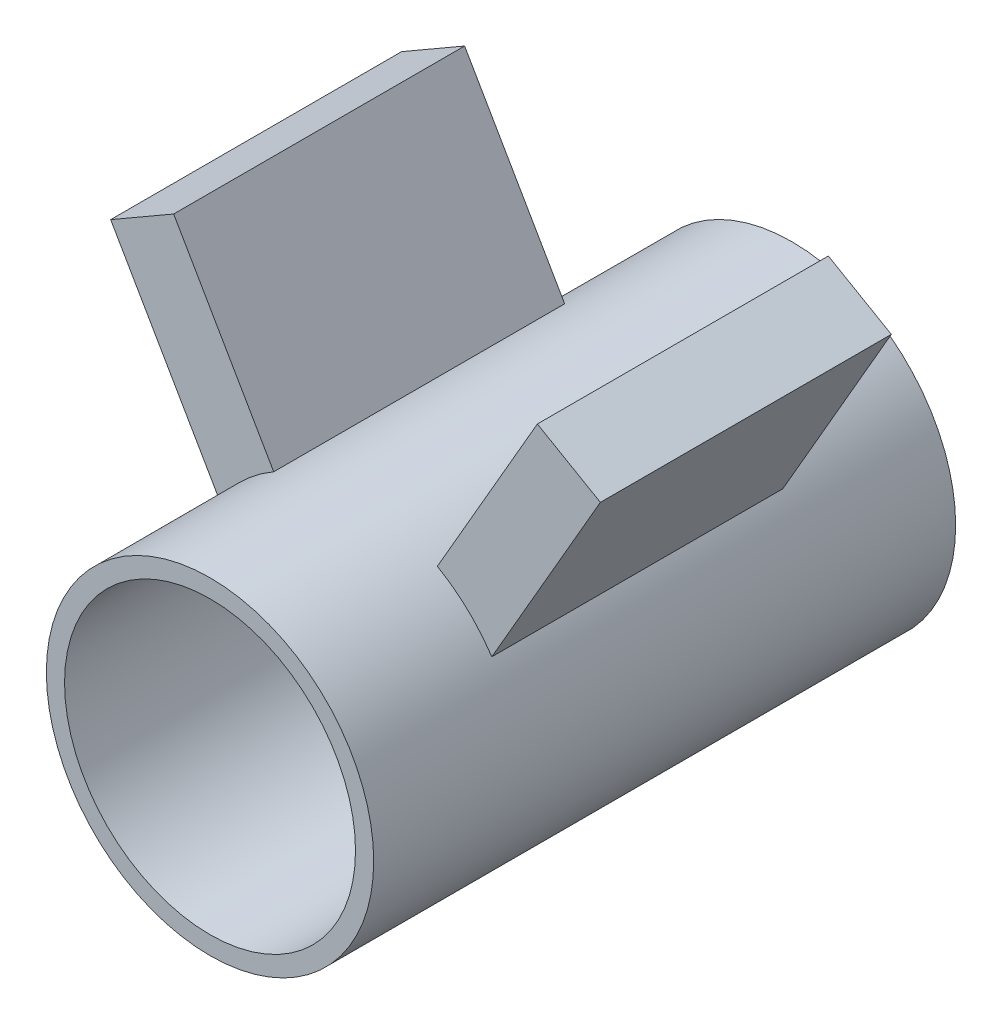
ISO-10303-21;
HEADER;
FILE_DESCRIPTION(('STEP AP214'),'2;1');
FILE_NAME('part.step','',(''),(''),'','','');
FILE_SCHEMA(('AUTOMOTIVE_DESIGN { 1 0 10303 214 1 1 1 1 }'));
ENDSEC;
DATA;
#1=APPLICATION_CONTEXT('core data for automotive mechanical design processes');
#2=APPLICATION_PROTOCOL_DEFINITION('international standard','automotive_design',2000,#1);
#3=PRODUCT_CONTEXT('',#1,'mechanical');
#4=PRODUCT('Part','Part','',(#3));
#5=PRODUCT_RELATED_PRODUCT_CATEGORY('part','',(#4));
#6=PRODUCT_DEFINITION_FORMATION('','',#4);
#7=PRODUCT_DEFINITION_CONTEXT('part definition',#1,'design');
#8=PRODUCT_DEFINITION('design','',#6,#7);
#9=PRODUCT_DEFINITION_SHAPE('','',#8);
#10=(LENGTH_UNIT() NAMED_UNIT(*) SI_UNIT(.MILLI.,.METRE.));
#11=(NAMED_UNIT(*) PLANE_ANGLE_UNIT() SI_UNIT($,.RADIAN.));
#12=(NAMED_UNIT(*) SI_UNIT($,.STERADIAN.) SOLID_ANGLE_UNIT());
#13=UNCERTAINTY_MEASURE_WITH_UNIT(LENGTH_MEASURE(1.E-05),#10,'distance_accuracy_value','');
#14=(GEOMETRIC_REPRESENTATION_CONTEXT(3) GLOBAL_UNCERTAINTY_ASSIGNED_CONTEXT((#13)) GLOBAL_UNIT_ASSIGNED_CONTEXT((#10,
#11,#12)) REPRESENTATION_CONTEXT('',''));
#15=CARTESIAN_POINT('',(0.,0.,0.));
#16=DIRECTION('',(0.,0.,1.));
#17=DIRECTION('',(1.,0.,0.));
#18=AXIS2_PLACEMENT_3D('',#15,#16,#17);
#19=CARTESIAN_POINT('',(0.,0.,25.4));
#20=DIRECTION('',(0.,0.,-1.));
#21=DIRECTION('',(-1.,0.,0.));
#22=AXIS2_PLACEMENT_3D('',#19,#20,#21);
#23=CYLINDRICAL_SURFACE('',#22,12.7);
#24=CARTESIAN_POINT('',(0.,0.,25.4));
#25=DIRECTION('',(0.,0.,1.));
#26=DIRECTION('',(1.,0.,0.));
#27=AXIS2_PLACEMENT_3D('',#24,#25,#26);
#28=CIRCLE('',#27,12.7);
#29=CARTESIAN_POINT('',(12.7,0.,25.4));
#30=VERTEX_POINT('',#29);
#31=EDGE_CURVE('E25',#30,#30,#28,.T.);
#32=ORIENTED_EDGE('',*,*,#31,.T.);
#33=EDGE_LOOP('',(#32));
#34=FACE_BOUND('',#33,.T.);
#35=CARTESIAN_POINT('',(0.,0.,-25.4));
#36=DIRECTION('',(0.,0.,1.));
#37=DIRECTION('',(1.,0.,0.));
#38=AXIS2_PLACEMENT_3D('',#35,#36,#37);
#39=CIRCLE('',#38,12.7);
#40=CARTESIAN_POINT('',(12.7,0.,-25.4));
#41=VERTEX_POINT('',#40);
#42=EDGE_CURVE('E144',#41,#41,#39,.T.);
#43=ORIENTED_EDGE('',*,*,#42,.F.);
#44=EDGE_LOOP('',(#43));
#45=FACE_BOUND('',#44,.T.);
#46=ADVANCED_FACE('F17',(#34,#45),#23,.F.);
#47=CARTESIAN_POINT('',(0.,0.,25.4));
#48=DIRECTION('',(0.,0.,-1.));
#49=DIRECTION('',(-1.,0.,0.));
#50=AXIS2_PLACEMENT_3D('',#47,#48,#49);
#51=CYLINDRICAL_SURFACE('',#50,14.2875);
#52=DIRECTION('',(0.,0.,-1.));
#53=VECTOR('',#52,1.);
#54=CARTESIAN_POINT('',(-7.14375,12.3733379565702,12.7));
#55=LINE('',#54,#53);
#56=CARTESIAN_POINT('',(-7.14375,12.3733379565702,12.7));
#57=VERTEX_POINT('',#56);
#58=CARTESIAN_POINT('',(-7.14375,12.3733379565702,-12.7));
#59=VERTEX_POINT('',#58);
#60=EDGE_CURVE('E33',#57,#59,#55,.T.);
#61=ORIENTED_EDGE('',*,*,#60,.F.);
#62=CARTESIAN_POINT('',(0.,0.,12.7));
#63=DIRECTION('',(0.,0.,1.));
#64=DIRECTION('',(1.,0.,0.));
#65=AXIS2_PLACEMENT_3D('',#62,#63,#64);
#66=CIRCLE('',#65,14.2875);
#67=CARTESIAN_POINT('',(-11.8986784017432,7.90911553474159,12.7));
#68=VERTEX_POINT('',#67);
#69=EDGE_CURVE('E38',#57,#68,#66,.T.);
#70=ORIENTED_EDGE('',*,*,#69,.T.);
#71=DIRECTION('',(0.,0.,-1.));
#72=VECTOR('',#71,1.);
#73=CARTESIAN_POINT('',(-11.8986784017432,7.90911553474159,12.7));
#74=LINE('',#73,#72);
#75=CARTESIAN_POINT('',(-11.8986784017432,7.90911553474159,-12.7));
#76=VERTEX_POINT('',#75);
#77=EDGE_CURVE('E102',#68,#76,#74,.T.);
#78=ORIENTED_EDGE('',*,*,#77,.T.);
#79=CARTESIAN_POINT('',(0.,0.,-12.7));
#80=DIRECTION('',(0.,0.,1.));
#81=DIRECTION('',(1.,0.,0.));
#82=AXIS2_PLACEMENT_3D('',#79,#80,#81);
#83=CIRCLE('',#82,14.2875);
#84=EDGE_CURVE('E106',#59,#76,#83,.T.);
#85=ORIENTED_EDGE('',*,*,#84,.F.);
#86=EDGE_LOOP('',(#61,#70,#78,#85));
#87=FACE_BOUND('',#86,.T.);
#88=DIRECTION('',(0.,0.,-1.));
#89=VECTOR('',#88,1.);
#90=CARTESIAN_POINT('',(11.8986784017432,7.90911553474158,12.7));
#91=LINE('',#90,#89);
#92=CARTESIAN_POINT('',(11.8986784017432,7.90911553474159,12.7));
#93=VERTEX_POINT('',#92);
#94=CARTESIAN_POINT('',(11.8986784017432,7.90911553474159,-12.7));
#95=VERTEX_POINT('',#94);
#96=EDGE_CURVE('E145',#93,#95,#91,.T.);
#97=ORIENTED_EDGE('',*,*,#96,.F.);
#98=CARTESIAN_POINT('',(0.,0.,12.7));
#99=DIRECTION('',(0.,0.,1.));
#100=DIRECTION('',(1.,0.,0.));
#101=AXIS2_PLACEMENT_3D('',#98,#99,#100);
#102=CIRCLE('',#101,14.2875);
#103=CARTESIAN_POINT('',(7.14375,12.3733379565702,12.7));
#104=VERTEX_POINT('',#103);
#105=EDGE_CURVE('E126',#93,#104,#102,.T.);
#106=ORIENTED_EDGE('',*,*,#105,.T.);
#107=DIRECTION('',(0.,0.,-1.));
#108=VECTOR('',#107,1.);
#109=CARTESIAN_POINT('',(7.14375,12.3733379565702,12.7));
#110=LINE('',#109,#108);
#111=CARTESIAN_POINT('',(7.14375,12.3733379565702,-12.7));
#112=VERTEX_POINT('',#111);
#113=EDGE_CURVE('E142',#104,#112,#110,.T.);
#114=ORIENTED_EDGE('',*,*,#113,.T.);
#115=CARTESIAN_POINT('',(0.,0.,-12.7));
#116=DIRECTION('',(0.,0.,1.));
#117=DIRECTION('',(1.,0.,0.));
#118=AXIS2_PLACEMENT_3D('',#115,#116,#117);
#119=CIRCLE('',#118,14.2875);
#120=EDGE_CURVE('E137',#95,#112,#119,.T.);
#121=ORIENTED_EDGE('',*,*,#120,.F.);
#122=EDGE_LOOP('',(#97,#106,#114,#121));
#123=FACE_BOUND('',#122,.T.);
#124=CARTESIAN_POINT('',(0.,0.,25.4));
#125=DIRECTION('',(0.,0.,1.));
#126=DIRECTION('',(1.,0.,0.));
#127=AXIS2_PLACEMENT_3D('',#124,#125,#126);
#128=CIRCLE('',#127,14.2875);
#129=CARTESIAN_POINT('',(14.2875,0.,25.4));
#130=VERTEX_POINT('',#129);
#131=EDGE_CURVE('E11',#130,#130,#128,.T.);
#132=ORIENTED_EDGE('',*,*,#131,.F.);
#133=EDGE_LOOP('',(#132));
#134=FACE_BOUND('',#133,.T.);
#135=CARTESIAN_POINT('',(0.,0.,-25.4));
#136=DIRECTION('',(0.,0.,1.));
#137=DIRECTION('',(1.,0.,0.));
#138=AXIS2_PLACEMENT_3D('',#135,#136,#137);
#139=CIRCLE('',#138,14.2875);
#140=CARTESIAN_POINT('',(14.2875,0.,-25.4));
#141=VERTEX_POINT('',#140);
#142=EDGE_CURVE('E20',#141,#141,#139,.T.);
#143=ORIENTED_EDGE('',*,*,#142,.T.);
#144=EDGE_LOOP('',(#143));
#145=FACE_BOUND('',#144,.T.);
#146=ADVANCED_FACE('F158',(#87,#123,#134,#145),#51,.T.);
#147=CARTESIAN_POINT('',(0.,0.,25.4));
#148=DIRECTION('',(0.,0.,1.));
#149=DIRECTION('',(1.,0.,0.));
#150=AXIS2_PLACEMENT_3D('',#147,#148,#149);
#151=PLANE('',#150);
#152=ORIENTED_EDGE('',*,*,#31,.F.);
#153=EDGE_LOOP('',(#152));
#154=FACE_BOUND('',#153,.T.);
#155=ORIENTED_EDGE('',*,*,#131,.T.);
#156=EDGE_LOOP('',(#155));
#157=FACE_BOUND('',#156,.T.);
#158=ADVANCED_FACE('F163',(#154,#157),#151,.T.);
#159=CARTESIAN_POINT('',(0.,0.,-25.4));
#160=DIRECTION('',(0.,0.,1.));
#161=DIRECTION('',(1.,0.,0.));
#162=AXIS2_PLACEMENT_3D('',#159,#160,#161);
#163=PLANE('',#162);
#164=ORIENTED_EDGE('',*,*,#42,.T.);
#165=EDGE_LOOP('',(#164));
#166=FACE_BOUND('',#165,.T.);
#167=ORIENTED_EDGE('',*,*,#142,.F.);
#168=EDGE_LOOP('',(#167));
#169=FACE_BOUND('',#168,.T.);
#170=ADVANCED_FACE('F160',(#166,#169),#163,.F.);
#171=CARTESIAN_POINT('',(11.509375,19.934822263363,12.7));
#172=DIRECTION('',(-0.866025403784439,0.5,0.));
#173=DIRECTION('',(-0.5,-0.866025403784439,0.));
#174=AXIS2_PLACEMENT_3D('',#171,#172,#173);
#175=PLANE('',#174);
#176=DIRECTION('',(0.5,0.866025403784439,0.));
#177=VECTOR('',#176,1.);
#178=CARTESIAN_POINT('',(11.509375,19.934822263363,-12.7));
#179=LINE('',#178,#177);
#180=CARTESIAN_POINT('',(15.875,27.496306570156,-12.7));
#181=VERTEX_POINT('',#180);
#182=EDGE_CURVE('E123',#112,#181,#179,.T.);
#183=ORIENTED_EDGE('',*,*,#182,.F.);
#184=ORIENTED_EDGE('',*,*,#113,.F.);
#185=DIRECTION('',(0.5,0.866025403784439,0.));
#186=VECTOR('',#185,1.);
#187=CARTESIAN_POINT('',(11.509375,19.934822263363,12.7));
#188=LINE('',#187,#186);
#189=CARTESIAN_POINT('',(15.875,27.496306570156,12.7));
#190=VERTEX_POINT('',#189);
#191=EDGE_CURVE('E128',#104,#190,#188,.T.);
#192=ORIENTED_EDGE('',*,*,#191,.T.);
#193=DIRECTION('',(0.,0.,-1.));
#194=VECTOR('',#193,1.);
#195=CARTESIAN_POINT('',(15.875,27.496306570156,12.7));
#196=LINE('',#195,#194);
#197=EDGE_CURVE('E131',#190,#181,#196,.T.);
#198=ORIENTED_EDGE('',*,*,#197,.T.);
#199=EDGE_LOOP('',(#183,#184,#192,#198));
#200=FACE_BOUND('',#199,.T.);
#201=ADVANCED_FACE('F162',(#200),#175,.T.);
#202=CARTESIAN_POINT('',(16.6364698578871,16.1152110524487,12.7));
#203=DIRECTION('',(0.866025403784439,-0.5,0.));
#204=DIRECTION('',(0.5,0.866025403784439,0.));
#205=AXIS2_PLACEMENT_3D('',#202,#203,#204);
#206=PLANE('',#205);
#207=DIRECTION('',(-0.5,-0.866025403784439,0.));
#208=VECTOR('',#207,1.);
#209=CARTESIAN_POINT('',(16.6364698578871,16.1152110524487,-12.7));
#210=LINE('',#209,#208);
#211=CARTESIAN_POINT('',(21.3742613140312,24.321306570156,-12.7));
#212=VERTEX_POINT('',#211);
#213=EDGE_CURVE('E134',#212,#95,#210,.T.);
#214=ORIENTED_EDGE('',*,*,#213,.F.);
#215=DIRECTION('',(0.,0.,-1.));
#216=VECTOR('',#215,1.);
#217=CARTESIAN_POINT('',(21.3742613140312,24.321306570156,12.7));
#218=LINE('',#217,#216);
#219=CARTESIAN_POINT('',(21.3742613140312,24.321306570156,12.7));
#220=VERTEX_POINT('',#219);
#221=EDGE_CURVE('E148',#220,#212,#218,.T.);
#222=ORIENTED_EDGE('',*,*,#221,.F.);
#223=DIRECTION('',(-0.5,-0.866025403784439,0.));
#224=VECTOR('',#223,1.);
#225=CARTESIAN_POINT('',(16.6364698578871,16.1152110524487,12.7));
#226=LINE('',#225,#224);
#227=EDGE_CURVE('E122',#220,#93,#226,.T.);
#228=ORIENTED_EDGE('',*,*,#227,.T.);
#229=ORIENTED_EDGE('',*,*,#96,.T.);
#230=EDGE_LOOP('',(#214,#222,#228,#229));
#231=FACE_BOUND('',#230,.T.);
#232=ADVANCED_FACE('F170',(#231),#206,.T.);
#233=CARTESIAN_POINT('',(18.6246306570156,25.9088065701559,12.7));
#234=DIRECTION('',(0.5,0.866025403784439,0.));
#235=DIRECTION('',(-0.866025403784439,0.5,0.));
#236=AXIS2_PLACEMENT_3D('',#233,#234,#235);
#237=PLANE('',#236);
#238=DIRECTION('',(0.866025403784439,-0.5,0.));
#239=VECTOR('',#238,1.);
#240=CARTESIAN_POINT('',(18.6246306570156,25.9088065701559,-12.7));
#241=LINE('',#240,#239);
#242=EDGE_CURVE('E118',#181,#212,#241,.T.);
#243=ORIENTED_EDGE('',*,*,#242,.F.);
#244=ORIENTED_EDGE('',*,*,#197,.F.);
#245=DIRECTION('',(0.866025403784439,-0.5,0.));
#246=VECTOR('',#245,1.);
#247=CARTESIAN_POINT('',(18.6246306570156,25.9088065701559,12.7));
#248=LINE('',#247,#246);
#249=EDGE_CURVE('E119',#190,#220,#248,.T.);
#250=ORIENTED_EDGE('',*,*,#249,.T.);
#251=ORIENTED_EDGE('',*,*,#221,.T.);
#252=EDGE_LOOP('',(#243,#244,#250,#251));
#253=FACE_BOUND('',#252,.T.);
#254=ADVANCED_FACE('F199',(#253),#237,.T.);
#255=CARTESIAN_POINT('',(0.,6.60440328507796,12.7));
#256=DIRECTION('',(0.,0.,1.));
#257=DIRECTION('',(1.,0.,0.));
#258=AXIS2_PLACEMENT_3D('',#255,#256,#257);
#259=PLANE('',#258);
#260=ORIENTED_EDGE('',*,*,#191,.F.);
#261=ORIENTED_EDGE('',*,*,#105,.F.);
#262=ORIENTED_EDGE('',*,*,#227,.F.);
#263=ORIENTED_EDGE('',*,*,#249,.F.);
#264=EDGE_LOOP('',(#260,#261,#262,#263));
#265=FACE_BOUND('',#264,.T.);
#266=ADVANCED_FACE('F195',(#265),#259,.T.);
#267=CARTESIAN_POINT('',(0.,6.60440328507796,-12.7));
#268=DIRECTION('',(0.,0.,1.));
#269=DIRECTION('',(1.,0.,0.));
#270=AXIS2_PLACEMENT_3D('',#267,#268,#269);
#271=PLANE('',#270);
#272=ORIENTED_EDGE('',*,*,#182,.T.);
#273=ORIENTED_EDGE('',*,*,#242,.T.);
#274=ORIENTED_EDGE('',*,*,#213,.T.);
#275=ORIENTED_EDGE('',*,*,#120,.T.);
#276=EDGE_LOOP('',(#272,#273,#274,#275));
#277=FACE_BOUND('',#276,.T.);
#278=ADVANCED_FACE('F202',(#277),#271,.F.);
#279=CARTESIAN_POINT('',(-11.509375,19.934822263363,12.7));
#280=DIRECTION('',(-0.866025403784439,-0.5,0.));
#281=DIRECTION('',(0.5,-0.866025403784439,0.));
#282=AXIS2_PLACEMENT_3D('',#279,#280,#281);
#283=PLANE('',#282);
#284=DIRECTION('',(-0.5,0.866025403784439,0.));
#285=VECTOR('',#284,1.);
#286=CARTESIAN_POINT('',(-11.509375,19.934822263363,-12.7));
#287=LINE('',#286,#285);
#288=CARTESIAN_POINT('',(-15.875,27.496306570156,-12.7));
#289=VERTEX_POINT('',#288);
#290=EDGE_CURVE('E92',#59,#289,#287,.T.);
#291=ORIENTED_EDGE('',*,*,#290,.T.);
#292=DIRECTION('',(0.,0.,-1.));
#293=VECTOR('',#292,1.);
#294=CARTESIAN_POINT('',(-15.875,27.496306570156,12.7));
#295=LINE('',#294,#293);
#296=CARTESIAN_POINT('',(-15.875,27.496306570156,12.7));
#297=VERTEX_POINT('',#296);
#298=EDGE_CURVE('E89',#297,#289,#295,.T.);
#299=ORIENTED_EDGE('',*,*,#298,.F.);
#300=DIRECTION('',(-0.5,0.866025403784439,0.));
#301=VECTOR('',#300,1.);
#302=CARTESIAN_POINT('',(-11.509375,19.934822263363,12.7));
#303=LINE('',#302,#301);
#304=EDGE_CURVE('E80',#57,#297,#303,.T.);
#305=ORIENTED_EDGE('',*,*,#304,.F.);
#306=ORIENTED_EDGE('',*,*,#60,.T.);
#307=EDGE_LOOP('',(#291,#299,#305,#306));
#308=FACE_BOUND('',#307,.T.);
#309=ADVANCED_FACE('F90',(#308),#283,.F.);
#310=CARTESIAN_POINT('',(-18.6246306570156,25.9088065701559,12.7));
#311=DIRECTION('',(0.5,-0.866025403784439,0.));
#312=DIRECTION('',(0.866025403784439,0.5,0.));
#313=AXIS2_PLACEMENT_3D('',#310,#311,#312);
#314=PLANE('',#313);
#315=DIRECTION('',(-0.866025403784439,-0.5,0.));
#316=VECTOR('',#315,1.);
#317=CARTESIAN_POINT('',(-18.6246306570156,25.9088065701559,-12.7));
#318=LINE('',#317,#316);
#319=CARTESIAN_POINT('',(-21.3742613140312,24.321306570156,-12.7));
#320=VERTEX_POINT('',#319);
#321=EDGE_CURVE('E110',#289,#320,#318,.T.);
#322=ORIENTED_EDGE('',*,*,#321,.T.);
#323=DIRECTION('',(0.,0.,-1.));
#324=VECTOR('',#323,1.);
#325=CARTESIAN_POINT('',(-21.3742613140312,24.321306570156,12.7));
#326=LINE('',#325,#324);
#327=CARTESIAN_POINT('',(-21.3742613140312,24.321306570156,12.7));
#328=VERTEX_POINT('',#327);
#329=EDGE_CURVE('E95',#328,#320,#326,.T.);
#330=ORIENTED_EDGE('',*,*,#329,.F.);
#331=DIRECTION('',(-0.866025403784439,-0.5,0.));
#332=VECTOR('',#331,1.);
#333=CARTESIAN_POINT('',(-18.6246306570156,25.9088065701559,12.7));
#334=LINE('',#333,#332);
#335=EDGE_CURVE('E84',#297,#328,#334,.T.);
#336=ORIENTED_EDGE('',*,*,#335,.F.);
#337=ORIENTED_EDGE('',*,*,#298,.T.);
#338=EDGE_LOOP('',(#322,#330,#336,#337));
#339=FACE_BOUND('',#338,.T.);
#340=ADVANCED_FACE('F97',(#339),#314,.F.);
#341=CARTESIAN_POINT('',(-16.6364698578872,16.1152110524487,12.7));
#342=DIRECTION('',(0.866025403784439,0.5,0.));
#343=DIRECTION('',(-0.5,0.866025403784439,0.));
#344=AXIS2_PLACEMENT_3D('',#341,#342,#343);
#345=PLANE('',#344);
#346=DIRECTION('',(0.5,-0.866025403784439,0.));
#347=VECTOR('',#346,1.);
#348=CARTESIAN_POINT('',(-16.6364698578872,16.1152110524487,-12.7));
#349=LINE('',#348,#347);
#350=EDGE_CURVE('E112',#320,#76,#349,.T.);
#351=ORIENTED_EDGE('',*,*,#350,.T.);
#352=ORIENTED_EDGE('',*,*,#77,.F.);
#353=DIRECTION('',(0.5,-0.866025403784439,0.));
#354=VECTOR('',#353,1.);
#355=CARTESIAN_POINT('',(-16.6364698578872,16.1152110524487,12.7));
#356=LINE('',#355,#354);
#357=EDGE_CURVE('E100',#328,#68,#356,.T.);
#358=ORIENTED_EDGE('',*,*,#357,.F.);
#359=ORIENTED_EDGE('',*,*,#329,.T.);
#360=EDGE_LOOP('',(#351,#352,#358,#359));
#361=FACE_BOUND('',#360,.T.);
#362=ADVANCED_FACE('F247',(#361),#345,.F.);
#363=CARTESIAN_POINT('',(0.,6.60440328507796,12.7));
#364=DIRECTION('',(0.,0.,1.));
#365=DIRECTION('',(1.,0.,0.));
#366=AXIS2_PLACEMENT_3D('',#363,#364,#365);
#367=PLANE('',#366);
#368=ORIENTED_EDGE('',*,*,#69,.F.);
#369=ORIENTED_EDGE('',*,*,#304,.T.);
#370=ORIENTED_EDGE('',*,*,#335,.T.);
#371=ORIENTED_EDGE('',*,*,#357,.T.);
#372=EDGE_LOOP('',(#368,#369,#370,#371));
#373=FACE_BOUND('',#372,.T.);
#374=ADVANCED_FACE('F82',(#373),#367,.T.);
#375=CARTESIAN_POINT('',(0.,6.60440328507796,-12.7));
#376=DIRECTION('',(0.,0.,1.));
#377=DIRECTION('',(1.,0.,0.));
#378=AXIS2_PLACEMENT_3D('',#375,#376,#377);
#379=PLANE('',#378);
#380=ORIENTED_EDGE('',*,*,#84,.T.);
#381=ORIENTED_EDGE('',*,*,#350,.F.);
#382=ORIENTED_EDGE('',*,*,#321,.F.);
#383=ORIENTED_EDGE('',*,*,#290,.F.);
#384=EDGE_LOOP('',(#380,#381,#382,#383));
#385=FACE_BOUND('',#384,.T.);
#386=ADVANCED_FACE('F265',(#385),#379,.F.);
#387=CLOSED_SHELL('',(#46,#146,#158,#170,#201,#232,#254,#266,#278,#309,#340,#362,#374,#386));
#388=MANIFOLD_SOLID_BREP('B1',#387);
#389=ADVANCED_BREP_SHAPE_REPRESENTATION('',(#18,#388),#14);
#390=SHAPE_DEFINITION_REPRESENTATION(#9,#389);
ENDSEC;
END-ISO-10303-21;
